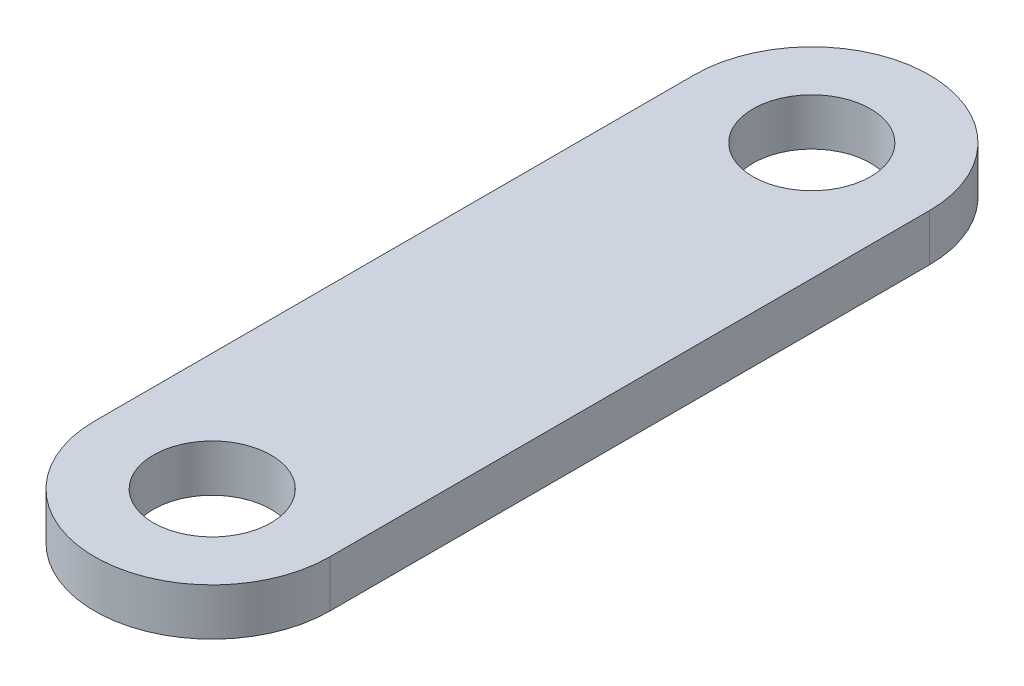
ISO-10303-21;
HEADER;
FILE_DESCRIPTION(('STEP AP214'),'2;1');
FILE_NAME('part.step','',(''),(''),'','','');
FILE_SCHEMA(('AUTOMOTIVE_DESIGN { 1 0 10303 214 1 1 1 1 }'));
ENDSEC;
DATA;
#1=APPLICATION_CONTEXT('core data for automotive mechanical design processes');
#2=APPLICATION_PROTOCOL_DEFINITION('international standard','automotive_design',2000,#1);
#3=PRODUCT_CONTEXT('',#1,'mechanical');
#4=PRODUCT('Part','Part','',(#3));
#5=PRODUCT_RELATED_PRODUCT_CATEGORY('part','',(#4));
#6=PRODUCT_DEFINITION_FORMATION('','',#4);
#7=PRODUCT_DEFINITION_CONTEXT('part definition',#1,'design');
#8=PRODUCT_DEFINITION('design','',#6,#7);
#9=PRODUCT_DEFINITION_SHAPE('','',#8);
#10=(LENGTH_UNIT() NAMED_UNIT(*) SI_UNIT(.MILLI.,.METRE.));
#11=(NAMED_UNIT(*) PLANE_ANGLE_UNIT() SI_UNIT($,.RADIAN.));
#12=(NAMED_UNIT(*) SI_UNIT($,.STERADIAN.) SOLID_ANGLE_UNIT());
#13=UNCERTAINTY_MEASURE_WITH_UNIT(LENGTH_MEASURE(1.E-05),#10,'distance_accuracy_value','');
#14=(GEOMETRIC_REPRESENTATION_CONTEXT(3) GLOBAL_UNCERTAINTY_ASSIGNED_CONTEXT((#13)) GLOBAL_UNIT_ASSIGNED_CONTEXT((#10,
#11,#12)) REPRESENTATION_CONTEXT('',''));
#15=CARTESIAN_POINT('',(0.,0.,0.));
#16=DIRECTION('',(0.,0.,1.));
#17=DIRECTION('',(1.,0.,0.));
#18=AXIS2_PLACEMENT_3D('',#15,#16,#17);
#19=CARTESIAN_POINT('',(0.,20.,0.));
#20=DIRECTION('',(0.,1.,0.));
#21=DIRECTION('',(0.,0.,1.));
#22=AXIS2_PLACEMENT_3D('',#19,#20,#21);
#23=PLANE('',#22);
#24=CARTESIAN_POINT('',(0.,20.,0.));
#25=DIRECTION('',(0.,1.,0.));
#26=DIRECTION('',(0.,0.,1.));
#27=AXIS2_PLACEMENT_3D('',#24,#25,#26);
#28=CIRCLE('',#27,25.);
#29=CARTESIAN_POINT('',(0.,20.,25.));
#30=VERTEX_POINT('',#29);
#31=EDGE_CURVE('E100',#30,#30,#28,.T.);
#32=ORIENTED_EDGE('',*,*,#31,.F.);
#33=EDGE_LOOP('',(#32));
#34=FACE_BOUND('',#33,.T.);
#35=CARTESIAN_POINT('',(0.,20.,0.));
#36=DIRECTION('',(0.,1.,0.));
#37=DIRECTION('',(0.,0.,1.));
#38=AXIS2_PLACEMENT_3D('',#35,#36,#37);
#39=CIRCLE('',#38,50.);
#40=CARTESIAN_POINT('',(50.,20.,0.));
#41=VERTEX_POINT('',#40);
#42=CARTESIAN_POINT('',(-50.,20.,0.));
#43=VERTEX_POINT('',#42);
#44=EDGE_CURVE('E85',#41,#43,#39,.T.);
#45=ORIENTED_EDGE('',*,*,#44,.T.);
#46=DIRECTION('',(0.,0.,1.));
#47=VECTOR('',#46,1.);
#48=CARTESIAN_POINT('',(-50.,20.,0.));
#49=LINE('',#48,#47);
#50=CARTESIAN_POINT('',(-50.,20.,255.));
#51=VERTEX_POINT('',#50);
#52=EDGE_CURVE('E80',#43,#51,#49,.T.);
#53=ORIENTED_EDGE('',*,*,#52,.T.);
#54=CARTESIAN_POINT('',(0.,20.,255.));
#55=DIRECTION('',(0.,1.,0.));
#56=DIRECTION('',(0.,0.,1.));
#57=AXIS2_PLACEMENT_3D('',#54,#55,#56);
#58=CIRCLE('',#57,50.);
#59=CARTESIAN_POINT('',(50.,20.,255.));
#60=VERTEX_POINT('',#59);
#61=EDGE_CURVE('E83',#51,#60,#58,.T.);
#62=ORIENTED_EDGE('',*,*,#61,.T.);
#63=DIRECTION('',(0.,0.,-1.));
#64=VECTOR('',#63,1.);
#65=CARTESIAN_POINT('',(50.,20.,0.));
#66=LINE('',#65,#64);
#67=EDGE_CURVE('E50',#60,#41,#66,.T.);
#68=ORIENTED_EDGE('',*,*,#67,.T.);
#69=EDGE_LOOP('',(#45,#53,#62,#68));
#70=FACE_BOUND('',#69,.T.);
#71=CARTESIAN_POINT('',(0.,20.,255.));
#72=DIRECTION('',(0.,1.,0.));
#73=DIRECTION('',(0.,0.,1.));
#74=AXIS2_PLACEMENT_3D('',#71,#72,#73);
#75=CIRCLE('',#74,25.);
#76=CARTESIAN_POINT('',(0.,20.,280.));
#77=VERTEX_POINT('',#76);
#78=EDGE_CURVE('E115',#77,#77,#75,.T.);
#79=ORIENTED_EDGE('',*,*,#78,.F.);
#80=EDGE_LOOP('',(#79));
#81=FACE_BOUND('',#80,.T.);
#82=ADVANCED_FACE('F33',(#34,#70,#81),#23,.T.);
#83=CARTESIAN_POINT('',(0.,0.,0.));
#84=DIRECTION('',(0.,1.,0.));
#85=DIRECTION('',(0.,0.,1.));
#86=AXIS2_PLACEMENT_3D('',#83,#84,#85);
#87=PLANE('',#86);
#88=CARTESIAN_POINT('',(0.,0.,0.));
#89=DIRECTION('',(0.,1.,0.));
#90=DIRECTION('',(0.,0.,1.));
#91=AXIS2_PLACEMENT_3D('',#88,#89,#90);
#92=CIRCLE('',#91,50.);
#93=CARTESIAN_POINT('',(50.,0.,0.));
#94=VERTEX_POINT('',#93);
#95=CARTESIAN_POINT('',(-50.,0.,0.));
#96=VERTEX_POINT('',#95);
#97=EDGE_CURVE('E97',#94,#96,#92,.T.);
#98=ORIENTED_EDGE('',*,*,#97,.F.);
#99=DIRECTION('',(0.,0.,-1.));
#100=VECTOR('',#99,1.);
#101=CARTESIAN_POINT('',(50.,0.,0.));
#102=LINE('',#101,#100);
#103=CARTESIAN_POINT('',(50.,0.,255.));
#104=VERTEX_POINT('',#103);
#105=EDGE_CURVE('E73',#104,#94,#102,.T.);
#106=ORIENTED_EDGE('',*,*,#105,.F.);
#107=CARTESIAN_POINT('',(0.,0.,255.));
#108=DIRECTION('',(0.,1.,0.));
#109=DIRECTION('',(0.,0.,1.));
#110=AXIS2_PLACEMENT_3D('',#107,#108,#109);
#111=CIRCLE('',#110,50.);
#112=CARTESIAN_POINT('',(-50.,0.,255.));
#113=VERTEX_POINT('',#112);
#114=EDGE_CURVE('E67',#113,#104,#111,.T.);
#115=ORIENTED_EDGE('',*,*,#114,.F.);
#116=DIRECTION('',(0.,0.,1.));
#117=VECTOR('',#116,1.);
#118=CARTESIAN_POINT('',(-50.,0.,0.));
#119=LINE('',#118,#117);
#120=EDGE_CURVE('E89',#96,#113,#119,.T.);
#121=ORIENTED_EDGE('',*,*,#120,.F.);
#122=EDGE_LOOP('',(#98,#106,#115,#121));
#123=FACE_BOUND('',#122,.T.);
#124=CARTESIAN_POINT('',(0.,0.,0.));
#125=DIRECTION('',(0.,1.,0.));
#126=DIRECTION('',(0.,0.,1.));
#127=AXIS2_PLACEMENT_3D('',#124,#125,#126);
#128=CIRCLE('',#127,25.);
#129=CARTESIAN_POINT('',(0.,0.,25.));
#130=VERTEX_POINT('',#129);
#131=EDGE_CURVE('E112',#130,#130,#128,.T.);
#132=ORIENTED_EDGE('',*,*,#131,.T.);
#133=EDGE_LOOP('',(#132));
#134=FACE_BOUND('',#133,.T.);
#135=CARTESIAN_POINT('',(0.,0.,255.));
#136=DIRECTION('',(0.,1.,0.));
#137=DIRECTION('',(0.,0.,1.));
#138=AXIS2_PLACEMENT_3D('',#135,#136,#137);
#139=CIRCLE('',#138,25.);
#140=CARTESIAN_POINT('',(0.,0.,280.));
#141=VERTEX_POINT('',#140);
#142=EDGE_CURVE('E118',#141,#141,#139,.T.);
#143=ORIENTED_EDGE('',*,*,#142,.T.);
#144=EDGE_LOOP('',(#143));
#145=FACE_BOUND('',#144,.T.);
#146=ADVANCED_FACE('F108',(#123,#134,#145),#87,.F.);
#147=CARTESIAN_POINT('',(0.,20.,0.));
#148=DIRECTION('',(0.,-1.,0.));
#149=DIRECTION('',(0.,0.,-1.));
#150=AXIS2_PLACEMENT_3D('',#147,#148,#149);
#151=CYLINDRICAL_SURFACE('',#150,50.);
#152=ORIENTED_EDGE('',*,*,#97,.T.);
#153=DIRECTION('',(0.,-1.,0.));
#154=VECTOR('',#153,1.);
#155=CARTESIAN_POINT('',(-50.,20.,0.));
#156=LINE('',#155,#154);
#157=EDGE_CURVE('E11',#43,#96,#156,.T.);
#158=ORIENTED_EDGE('',*,*,#157,.F.);
#159=ORIENTED_EDGE('',*,*,#44,.F.);
#160=DIRECTION('',(0.,-1.,0.));
#161=VECTOR('',#160,1.);
#162=CARTESIAN_POINT('',(50.,20.,0.));
#163=LINE('',#162,#161);
#164=EDGE_CURVE('E93',#41,#94,#163,.T.);
#165=ORIENTED_EDGE('',*,*,#164,.T.);
#166=EDGE_LOOP('',(#152,#158,#159,#165));
#167=FACE_BOUND('',#166,.T.);
#168=ADVANCED_FACE('F35',(#167),#151,.T.);
#169=CARTESIAN_POINT('',(-50.,20.,0.));
#170=DIRECTION('',(1.,0.,0.));
#171=DIRECTION('',(0.,0.,-1.));
#172=AXIS2_PLACEMENT_3D('',#169,#170,#171);
#173=PLANE('',#172);
#174=ORIENTED_EDGE('',*,*,#120,.T.);
#175=DIRECTION('',(0.,-1.,0.));
#176=VECTOR('',#175,1.);
#177=CARTESIAN_POINT('',(-50.,20.,255.));
#178=LINE('',#177,#176);
#179=EDGE_CURVE('E42',#51,#113,#178,.T.);
#180=ORIENTED_EDGE('',*,*,#179,.F.);
#181=ORIENTED_EDGE('',*,*,#52,.F.);
#182=ORIENTED_EDGE('',*,*,#157,.T.);
#183=EDGE_LOOP('',(#174,#180,#181,#182));
#184=FACE_BOUND('',#183,.T.);
#185=ADVANCED_FACE('F88',(#184),#173,.F.);
#186=CARTESIAN_POINT('',(0.,20.,255.));
#187=DIRECTION('',(0.,-1.,0.));
#188=DIRECTION('',(0.,0.,-1.));
#189=AXIS2_PLACEMENT_3D('',#186,#187,#188);
#190=CYLINDRICAL_SURFACE('',#189,50.);
#191=ORIENTED_EDGE('',*,*,#114,.T.);
#192=DIRECTION('',(0.,-1.,0.));
#193=VECTOR('',#192,1.);
#194=CARTESIAN_POINT('',(50.,20.,255.));
#195=LINE('',#194,#193);
#196=EDGE_CURVE('E90',#60,#104,#195,.T.);
#197=ORIENTED_EDGE('',*,*,#196,.F.);
#198=ORIENTED_EDGE('',*,*,#61,.F.);
#199=ORIENTED_EDGE('',*,*,#179,.T.);
#200=EDGE_LOOP('',(#191,#197,#198,#199));
#201=FACE_BOUND('',#200,.T.);
#202=ADVANCED_FACE('F91',(#201),#190,.T.);
#203=CARTESIAN_POINT('',(50.,20.,0.));
#204=DIRECTION('',(-1.,0.,0.));
#205=DIRECTION('',(0.,0.,1.));
#206=AXIS2_PLACEMENT_3D('',#203,#204,#205);
#207=PLANE('',#206);
#208=ORIENTED_EDGE('',*,*,#105,.T.);
#209=ORIENTED_EDGE('',*,*,#164,.F.);
#210=ORIENTED_EDGE('',*,*,#67,.F.);
#211=ORIENTED_EDGE('',*,*,#196,.T.);
#212=EDGE_LOOP('',(#208,#209,#210,#211));
#213=FACE_BOUND('',#212,.T.);
#214=ADVANCED_FACE('F105',(#213),#207,.F.);
#215=CARTESIAN_POINT('',(0.,20.,0.));
#216=DIRECTION('',(0.,-1.,0.));
#217=DIRECTION('',(0.,0.,-1.));
#218=AXIS2_PLACEMENT_3D('',#215,#216,#217);
#219=CYLINDRICAL_SURFACE('',#218,25.);
#220=ORIENTED_EDGE('',*,*,#31,.T.);
#221=EDGE_LOOP('',(#220));
#222=FACE_BOUND('',#221,.T.);
#223=ORIENTED_EDGE('',*,*,#131,.F.);
#224=EDGE_LOOP('',(#223));
#225=FACE_BOUND('',#224,.T.);
#226=ADVANCED_FACE('F135',(#222,#225),#219,.F.);
#227=CARTESIAN_POINT('',(0.,20.,255.));
#228=DIRECTION('',(0.,-1.,0.));
#229=DIRECTION('',(0.,0.,-1.));
#230=AXIS2_PLACEMENT_3D('',#227,#228,#229);
#231=CYLINDRICAL_SURFACE('',#230,25.);
#232=ORIENTED_EDGE('',*,*,#78,.T.);
#233=EDGE_LOOP('',(#232));
#234=FACE_BOUND('',#233,.T.);
#235=ORIENTED_EDGE('',*,*,#142,.F.);
#236=EDGE_LOOP('',(#235));
#237=FACE_BOUND('',#236,.T.);
#238=ADVANCED_FACE('F124',(#234,#237),#231,.F.);
#239=CLOSED_SHELL('',(#82,#146,#168,#185,#202,#214,#226,#238));
#240=MANIFOLD_SOLID_BREP('B2',#239);
#241=ADVANCED_BREP_SHAPE_REPRESENTATION('',(#18,#240),#14);
#242=SHAPE_DEFINITION_REPRESENTATION(#9,#241);
ENDSEC;
END-ISO-10303-21;
